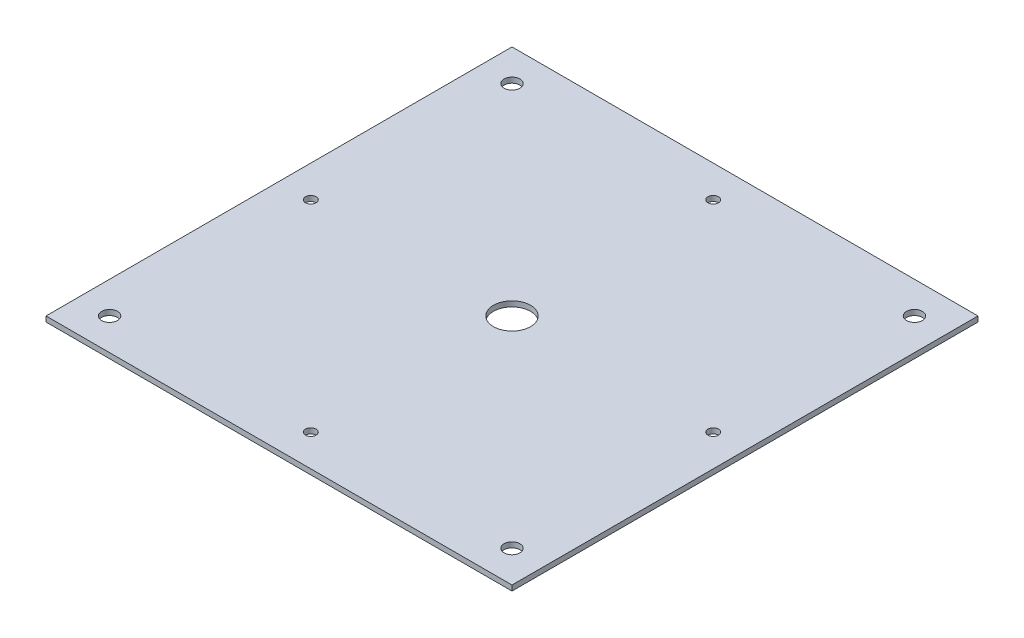
ISO-10303-21;
HEADER;
FILE_DESCRIPTION(('STEP AP214'),'2;1');
FILE_NAME('part.step','',(''),(''),'','','');
FILE_SCHEMA(('AUTOMOTIVE_DESIGN { 1 0 10303 214 1 1 1 1 }'));
ENDSEC;
DATA;
#1=APPLICATION_CONTEXT('core data for automotive mechanical design processes');
#2=APPLICATION_PROTOCOL_DEFINITION('international standard','automotive_design',2000,#1);
#3=PRODUCT_CONTEXT('',#1,'mechanical');
#4=PRODUCT('Part','Part','',(#3));
#5=PRODUCT_RELATED_PRODUCT_CATEGORY('part','',(#4));
#6=PRODUCT_DEFINITION_FORMATION('','',#4);
#7=PRODUCT_DEFINITION_CONTEXT('part definition',#1,'design');
#8=PRODUCT_DEFINITION('design','',#6,#7);
#9=PRODUCT_DEFINITION_SHAPE('','',#8);
#10=(LENGTH_UNIT() NAMED_UNIT(*) SI_UNIT(.MILLI.,.METRE.));
#11=(NAMED_UNIT(*) PLANE_ANGLE_UNIT() SI_UNIT($,.RADIAN.));
#12=(NAMED_UNIT(*) SI_UNIT($,.STERADIAN.) SOLID_ANGLE_UNIT());
#13=UNCERTAINTY_MEASURE_WITH_UNIT(LENGTH_MEASURE(1.E-05),#10,'distance_accuracy_value','');
#14=(GEOMETRIC_REPRESENTATION_CONTEXT(3) GLOBAL_UNCERTAINTY_ASSIGNED_CONTEXT((#13)) GLOBAL_UNIT_ASSIGNED_CONTEXT((#10,
#11,#12)) REPRESENTATION_CONTEXT('',''));
#15=CARTESIAN_POINT('',(0.,0.,0.));
#16=DIRECTION('',(0.,0.,1.));
#17=DIRECTION('',(1.,0.,0.));
#18=AXIS2_PLACEMENT_3D('',#15,#16,#17);
#19=CARTESIAN_POINT('',(0.,3.175,0.));
#20=DIRECTION('',(0.,1.,0.));
#21=DIRECTION('',(0.,0.,1.));
#22=AXIS2_PLACEMENT_3D('',#19,#20,#21);
#23=PLANE('',#22);
#24=CARTESIAN_POINT('',(120.649999999993,3.175,120.65));
#25=DIRECTION('',(0.,1.,0.));
#26=DIRECTION('',(0.,0.,1.));
#27=AXIS2_PLACEMENT_3D('',#24,#25,#26);
#28=CIRCLE('',#27,4.7625);
#29=CARTESIAN_POINT('',(120.649999999993,3.175,125.4125));
#30=VERTEX_POINT('',#29);
#31=EDGE_CURVE('E160',#30,#30,#28,.T.);
#32=ORIENTED_EDGE('',*,*,#31,.F.);
#33=EDGE_LOOP('',(#32));
#34=FACE_BOUND('',#33,.T.);
#35=CARTESIAN_POINT('',(-120.649999999993,3.175,120.65));
#36=DIRECTION('',(0.,1.,0.));
#37=DIRECTION('',(0.,0.,-1.));
#38=AXIS2_PLACEMENT_3D('',#35,#36,#37);
#39=CIRCLE('',#38,4.7625);
#40=CARTESIAN_POINT('',(-120.649999999993,3.175,115.8875));
#41=VERTEX_POINT('',#40);
#42=EDGE_CURVE('E154',#41,#41,#39,.T.);
#43=ORIENTED_EDGE('',*,*,#42,.F.);
#44=EDGE_LOOP('',(#43));
#45=FACE_BOUND('',#44,.T.);
#46=CARTESIAN_POINT('',(120.649999999993,3.175,-120.65));
#47=DIRECTION('',(0.,1.,0.));
#48=DIRECTION('',(0.,0.,-1.));
#49=AXIS2_PLACEMENT_3D('',#46,#47,#48);
#50=CIRCLE('',#49,4.7625);
#51=CARTESIAN_POINT('',(120.649999999993,3.175,-125.4125));
#52=VERTEX_POINT('',#51);
#53=EDGE_CURVE('E148',#52,#52,#50,.T.);
#54=ORIENTED_EDGE('',*,*,#53,.F.);
#55=EDGE_LOOP('',(#54));
#56=FACE_BOUND('',#55,.T.);
#57=CARTESIAN_POINT('',(-120.649999999993,3.175,-120.65));
#58=DIRECTION('',(0.,1.,0.));
#59=DIRECTION('',(0.,0.,1.));
#60=AXIS2_PLACEMENT_3D('',#57,#58,#59);
#61=CIRCLE('',#60,4.7625);
#62=CARTESIAN_POINT('',(-120.649999999993,3.175,-115.8875));
#63=VERTEX_POINT('',#62);
#64=EDGE_CURVE('E142',#63,#63,#61,.T.);
#65=ORIENTED_EDGE('',*,*,#64,.F.);
#66=EDGE_LOOP('',(#65));
#67=FACE_BOUND('',#66,.T.);
#68=CARTESIAN_POINT('',(-120.649999999993,3.175,6.85815848555649E-12));
#69=DIRECTION('',(0.,1.,0.));
#70=DIRECTION('',(0.,0.,1.));
#71=AXIS2_PLACEMENT_3D('',#68,#69,#70);
#72=CIRCLE('',#71,3.175);
#73=CARTESIAN_POINT('',(-120.649999999993,3.175,3.17500000000686));
#74=VERTEX_POINT('',#73);
#75=EDGE_CURVE('E136',#74,#74,#72,.T.);
#76=ORIENTED_EDGE('',*,*,#75,.F.);
#77=EDGE_LOOP('',(#76));
#78=FACE_BOUND('',#77,.T.);
#79=CARTESIAN_POINT('',(1.36867662438495E-11,3.175,120.65));
#80=DIRECTION('',(0.,1.,0.));
#81=DIRECTION('',(0.,0.,1.));
#82=AXIS2_PLACEMENT_3D('',#79,#80,#81);
#83=CIRCLE('',#82,3.175);
#84=CARTESIAN_POINT('',(1.36867662438495E-11,3.175,123.825));
#85=VERTEX_POINT('',#84);
#86=EDGE_CURVE('E130',#85,#85,#83,.T.);
#87=ORIENTED_EDGE('',*,*,#86,.F.);
#88=EDGE_LOOP('',(#87));
#89=FACE_BOUND('',#88,.T.);
#90=CARTESIAN_POINT('',(120.650000000007,3.175,-6.84338312192477E-12));
#91=DIRECTION('',(0.,1.,0.));
#92=DIRECTION('',(0.,0.,1.));
#93=AXIS2_PLACEMENT_3D('',#90,#91,#92);
#94=CIRCLE('',#93,3.175);
#95=CARTESIAN_POINT('',(120.650000000007,3.175,3.17499999999315));
#96=VERTEX_POINT('',#95);
#97=EDGE_CURVE('E124',#96,#96,#94,.T.);
#98=ORIENTED_EDGE('',*,*,#97,.F.);
#99=EDGE_LOOP('',(#98));
#100=FACE_BOUND('',#99,.T.);
#101=CARTESIAN_POINT('',(0.,3.175,-120.65));
#102=DIRECTION('',(0.,1.,0.));
#103=DIRECTION('',(0.,0.,1.));
#104=AXIS2_PLACEMENT_3D('',#101,#102,#103);
#105=CIRCLE('',#104,3.175);
#106=CARTESIAN_POINT('',(0.,3.175,-117.475));
#107=VERTEX_POINT('',#106);
#108=EDGE_CURVE('E118',#107,#107,#105,.T.);
#109=ORIENTED_EDGE('',*,*,#108,.F.);
#110=EDGE_LOOP('',(#109));
#111=FACE_BOUND('',#110,.T.);
#112=DIRECTION('',(0.,0.,1.));
#113=VECTOR('',#112,1.);
#114=CARTESIAN_POINT('',(-139.7,3.175,139.7));
#115=LINE('',#114,#113);
#116=CARTESIAN_POINT('',(-139.7,3.175,-139.7));
#117=VERTEX_POINT('',#116);
#118=CARTESIAN_POINT('',(-139.7,3.175,139.7));
#119=VERTEX_POINT('',#118);
#120=EDGE_CURVE('E85',#117,#119,#115,.T.);
#121=ORIENTED_EDGE('',*,*,#120,.T.);
#122=DIRECTION('',(1.,0.,0.));
#123=VECTOR('',#122,1.);
#124=CARTESIAN_POINT('',(139.7,3.175,139.7));
#125=LINE('',#124,#123);
#126=CARTESIAN_POINT('',(139.7,3.175,139.7));
#127=VERTEX_POINT('',#126);
#128=EDGE_CURVE('E80',#119,#127,#125,.T.);
#129=ORIENTED_EDGE('',*,*,#128,.T.);
#130=DIRECTION('',(0.,0.,-1.));
#131=VECTOR('',#130,1.);
#132=CARTESIAN_POINT('',(139.7,3.175,139.7));
#133=LINE('',#132,#131);
#134=CARTESIAN_POINT('',(139.7,3.175,-139.7));
#135=VERTEX_POINT('',#134);
#136=EDGE_CURVE('E83',#127,#135,#133,.T.);
#137=ORIENTED_EDGE('',*,*,#136,.T.);
#138=DIRECTION('',(-1.,0.,0.));
#139=VECTOR('',#138,1.);
#140=CARTESIAN_POINT('',(139.7,3.175,-139.7));
#141=LINE('',#140,#139);
#142=EDGE_CURVE('E50',#135,#117,#141,.T.);
#143=ORIENTED_EDGE('',*,*,#142,.T.);
#144=EDGE_LOOP('',(#121,#129,#137,#143));
#145=FACE_BOUND('',#144,.T.);
#146=CARTESIAN_POINT('',(0.,3.175,0.));
#147=DIRECTION('',(0.,1.,0.));
#148=DIRECTION('',(0.,0.,1.));
#149=AXIS2_PLACEMENT_3D('',#146,#147,#148);
#150=CIRCLE('',#149,11.1125);
#151=CARTESIAN_POINT('',(0.,3.175,11.1125));
#152=VERTEX_POINT('',#151);
#153=EDGE_CURVE('E100',#152,#152,#150,.T.);
#154=ORIENTED_EDGE('',*,*,#153,.F.);
#155=EDGE_LOOP('',(#154));
#156=FACE_BOUND('',#155,.T.);
#157=ADVANCED_FACE('F33',(#34,#45,#56,#67,#78,#89,#100,#111,#145,#156),#23,.T.);
#158=CARTESIAN_POINT('',(0.,0.,0.));
#159=DIRECTION('',(0.,1.,0.));
#160=DIRECTION('',(0.,0.,1.));
#161=AXIS2_PLACEMENT_3D('',#158,#159,#160);
#162=PLANE('',#161);
#163=CARTESIAN_POINT('',(120.649999999993,0.,120.65));
#164=DIRECTION('',(0.,1.,0.));
#165=DIRECTION('',(0.,0.,1.));
#166=AXIS2_PLACEMENT_3D('',#163,#164,#165);
#167=CIRCLE('',#166,4.7625);
#168=CARTESIAN_POINT('',(120.649999999993,0.,125.4125));
#169=VERTEX_POINT('',#168);
#170=EDGE_CURVE('E157',#169,#169,#167,.T.);
#171=ORIENTED_EDGE('',*,*,#170,.T.);
#172=EDGE_LOOP('',(#171));
#173=FACE_BOUND('',#172,.T.);
#174=CARTESIAN_POINT('',(-120.649999999993,0.,120.65));
#175=DIRECTION('',(0.,1.,0.));
#176=DIRECTION('',(0.,0.,-1.));
#177=AXIS2_PLACEMENT_3D('',#174,#175,#176);
#178=CIRCLE('',#177,4.7625);
#179=CARTESIAN_POINT('',(-120.649999999993,0.,115.8875));
#180=VERTEX_POINT('',#179);
#181=EDGE_CURVE('E151',#180,#180,#178,.T.);
#182=ORIENTED_EDGE('',*,*,#181,.T.);
#183=EDGE_LOOP('',(#182));
#184=FACE_BOUND('',#183,.T.);
#185=CARTESIAN_POINT('',(120.649999999993,0.,-120.65));
#186=DIRECTION('',(0.,1.,0.));
#187=DIRECTION('',(0.,0.,-1.));
#188=AXIS2_PLACEMENT_3D('',#185,#186,#187);
#189=CIRCLE('',#188,4.7625);
#190=CARTESIAN_POINT('',(120.649999999993,0.,-125.4125));
#191=VERTEX_POINT('',#190);
#192=EDGE_CURVE('E145',#191,#191,#189,.T.);
#193=ORIENTED_EDGE('',*,*,#192,.T.);
#194=EDGE_LOOP('',(#193));
#195=FACE_BOUND('',#194,.T.);
#196=CARTESIAN_POINT('',(-120.649999999993,0.,-120.65));
#197=DIRECTION('',(0.,1.,0.));
#198=DIRECTION('',(0.,0.,1.));
#199=AXIS2_PLACEMENT_3D('',#196,#197,#198);
#200=CIRCLE('',#199,4.7625);
#201=CARTESIAN_POINT('',(-120.649999999993,0.,-115.8875));
#202=VERTEX_POINT('',#201);
#203=EDGE_CURVE('E139',#202,#202,#200,.T.);
#204=ORIENTED_EDGE('',*,*,#203,.T.);
#205=EDGE_LOOP('',(#204));
#206=FACE_BOUND('',#205,.T.);
#207=CARTESIAN_POINT('',(-120.649999999993,0.,6.85815848555649E-12));
#208=DIRECTION('',(0.,1.,0.));
#209=DIRECTION('',(0.,0.,1.));
#210=AXIS2_PLACEMENT_3D('',#207,#208,#209);
#211=CIRCLE('',#210,3.175);
#212=CARTESIAN_POINT('',(-120.649999999993,0.,3.17500000000686));
#213=VERTEX_POINT('',#212);
#214=EDGE_CURVE('E133',#213,#213,#211,.T.);
#215=ORIENTED_EDGE('',*,*,#214,.T.);
#216=EDGE_LOOP('',(#215));
#217=FACE_BOUND('',#216,.T.);
#218=CARTESIAN_POINT('',(1.36867662438495E-11,0.,120.65));
#219=DIRECTION('',(0.,1.,0.));
#220=DIRECTION('',(0.,0.,1.));
#221=AXIS2_PLACEMENT_3D('',#218,#219,#220);
#222=CIRCLE('',#221,3.175);
#223=CARTESIAN_POINT('',(1.36867662438495E-11,0.,123.825));
#224=VERTEX_POINT('',#223);
#225=EDGE_CURVE('E127',#224,#224,#222,.T.);
#226=ORIENTED_EDGE('',*,*,#225,.T.);
#227=EDGE_LOOP('',(#226));
#228=FACE_BOUND('',#227,.T.);
#229=CARTESIAN_POINT('',(120.650000000007,0.,-6.84338312192477E-12));
#230=DIRECTION('',(0.,1.,0.));
#231=DIRECTION('',(0.,0.,1.));
#232=AXIS2_PLACEMENT_3D('',#229,#230,#231);
#233=CIRCLE('',#232,3.175);
#234=CARTESIAN_POINT('',(120.650000000007,0.,3.17499999999315));
#235=VERTEX_POINT('',#234);
#236=EDGE_CURVE('E121',#235,#235,#233,.T.);
#237=ORIENTED_EDGE('',*,*,#236,.T.);
#238=EDGE_LOOP('',(#237));
#239=FACE_BOUND('',#238,.T.);
#240=CARTESIAN_POINT('',(0.,0.,-120.65));
#241=DIRECTION('',(0.,1.,0.));
#242=DIRECTION('',(0.,0.,1.));
#243=AXIS2_PLACEMENT_3D('',#240,#241,#242);
#244=CIRCLE('',#243,3.175);
#245=CARTESIAN_POINT('',(0.,0.,-117.475));
#246=VERTEX_POINT('',#245);
#247=EDGE_CURVE('E115',#246,#246,#244,.T.);
#248=ORIENTED_EDGE('',*,*,#247,.T.);
#249=EDGE_LOOP('',(#248));
#250=FACE_BOUND('',#249,.T.);
#251=DIRECTION('',(0.,0.,1.));
#252=VECTOR('',#251,1.);
#253=CARTESIAN_POINT('',(-139.7,0.,139.7));
#254=LINE('',#253,#252);
#255=CARTESIAN_POINT('',(-139.7,0.,-139.7));
#256=VERTEX_POINT('',#255);
#257=CARTESIAN_POINT('',(-139.7,0.,139.7));
#258=VERTEX_POINT('',#257);
#259=EDGE_CURVE('E97',#256,#258,#254,.T.);
#260=ORIENTED_EDGE('',*,*,#259,.F.);
#261=DIRECTION('',(-1.,0.,0.));
#262=VECTOR('',#261,1.);
#263=CARTESIAN_POINT('',(139.7,0.,-139.7));
#264=LINE('',#263,#262);
#265=CARTESIAN_POINT('',(139.7,0.,-139.7));
#266=VERTEX_POINT('',#265);
#267=EDGE_CURVE('E73',#266,#256,#264,.T.);
#268=ORIENTED_EDGE('',*,*,#267,.F.);
#269=DIRECTION('',(0.,0.,-1.));
#270=VECTOR('',#269,1.);
#271=CARTESIAN_POINT('',(139.7,0.,139.7));
#272=LINE('',#271,#270);
#273=CARTESIAN_POINT('',(139.7,0.,139.7));
#274=VERTEX_POINT('',#273);
#275=EDGE_CURVE('E67',#274,#266,#272,.T.);
#276=ORIENTED_EDGE('',*,*,#275,.F.);
#277=DIRECTION('',(1.,0.,0.));
#278=VECTOR('',#277,1.);
#279=CARTESIAN_POINT('',(139.7,0.,139.7));
#280=LINE('',#279,#278);
#281=EDGE_CURVE('E89',#258,#274,#280,.T.);
#282=ORIENTED_EDGE('',*,*,#281,.F.);
#283=EDGE_LOOP('',(#260,#268,#276,#282));
#284=FACE_BOUND('',#283,.T.);
#285=CARTESIAN_POINT('',(0.,0.,0.));
#286=DIRECTION('',(0.,1.,0.));
#287=DIRECTION('',(0.,0.,1.));
#288=AXIS2_PLACEMENT_3D('',#285,#286,#287);
#289=CIRCLE('',#288,11.1125);
#290=CARTESIAN_POINT('',(0.,0.,11.1125));
#291=VERTEX_POINT('',#290);
#292=EDGE_CURVE('E112',#291,#291,#289,.T.);
#293=ORIENTED_EDGE('',*,*,#292,.T.);
#294=EDGE_LOOP('',(#293));
#295=FACE_BOUND('',#294,.T.);
#296=ADVANCED_FACE('F108',(#173,#184,#195,#206,#217,#228,#239,#250,#284,#295),#162,.F.);
#297=CARTESIAN_POINT('',(-139.7,3.175,139.7));
#298=DIRECTION('',(1.,0.,0.));
#299=DIRECTION('',(0.,0.,-1.));
#300=AXIS2_PLACEMENT_3D('',#297,#298,#299);
#301=PLANE('',#300);
#302=ORIENTED_EDGE('',*,*,#259,.T.);
#303=DIRECTION('',(0.,-1.,0.));
#304=VECTOR('',#303,1.);
#305=CARTESIAN_POINT('',(-139.7,3.175,139.7));
#306=LINE('',#305,#304);
#307=EDGE_CURVE('E11',#119,#258,#306,.T.);
#308=ORIENTED_EDGE('',*,*,#307,.F.);
#309=ORIENTED_EDGE('',*,*,#120,.F.);
#310=DIRECTION('',(0.,-1.,0.));
#311=VECTOR('',#310,1.);
#312=CARTESIAN_POINT('',(-139.7,3.175,-139.7));
#313=LINE('',#312,#311);
#314=EDGE_CURVE('E93',#117,#256,#313,.T.);
#315=ORIENTED_EDGE('',*,*,#314,.T.);
#316=EDGE_LOOP('',(#302,#308,#309,#315));
#317=FACE_BOUND('',#316,.T.);
#318=ADVANCED_FACE('F35',(#317),#301,.F.);
#319=CARTESIAN_POINT('',(139.7,3.175,139.7));
#320=DIRECTION('',(0.,0.,-1.));
#321=DIRECTION('',(-1.,0.,0.));
#322=AXIS2_PLACEMENT_3D('',#319,#320,#321);
#323=PLANE('',#322);
#324=ORIENTED_EDGE('',*,*,#281,.T.);
#325=DIRECTION('',(0.,-1.,0.));
#326=VECTOR('',#325,1.);
#327=CARTESIAN_POINT('',(139.7,3.175,139.7));
#328=LINE('',#327,#326);
#329=EDGE_CURVE('E42',#127,#274,#328,.T.);
#330=ORIENTED_EDGE('',*,*,#329,.F.);
#331=ORIENTED_EDGE('',*,*,#128,.F.);
#332=ORIENTED_EDGE('',*,*,#307,.T.);
#333=EDGE_LOOP('',(#324,#330,#331,#332));
#334=FACE_BOUND('',#333,.T.);
#335=ADVANCED_FACE('F88',(#334),#323,.F.);
#336=CARTESIAN_POINT('',(139.7,3.175,139.7));
#337=DIRECTION('',(-1.,0.,0.));
#338=DIRECTION('',(0.,0.,1.));
#339=AXIS2_PLACEMENT_3D('',#336,#337,#338);
#340=PLANE('',#339);
#341=ORIENTED_EDGE('',*,*,#275,.T.);
#342=DIRECTION('',(0.,-1.,0.));
#343=VECTOR('',#342,1.);
#344=CARTESIAN_POINT('',(139.7,3.175,-139.7));
#345=LINE('',#344,#343);
#346=EDGE_CURVE('E90',#135,#266,#345,.T.);
#347=ORIENTED_EDGE('',*,*,#346,.F.);
#348=ORIENTED_EDGE('',*,*,#136,.F.);
#349=ORIENTED_EDGE('',*,*,#329,.T.);
#350=EDGE_LOOP('',(#341,#347,#348,#349));
#351=FACE_BOUND('',#350,.T.);
#352=ADVANCED_FACE('F91',(#351),#340,.F.);
#353=CARTESIAN_POINT('',(139.7,3.175,-139.7));
#354=DIRECTION('',(0.,0.,1.));
#355=DIRECTION('',(1.,0.,0.));
#356=AXIS2_PLACEMENT_3D('',#353,#354,#355);
#357=PLANE('',#356);
#358=ORIENTED_EDGE('',*,*,#267,.T.);
#359=ORIENTED_EDGE('',*,*,#314,.F.);
#360=ORIENTED_EDGE('',*,*,#142,.F.);
#361=ORIENTED_EDGE('',*,*,#346,.T.);
#362=EDGE_LOOP('',(#358,#359,#360,#361));
#363=FACE_BOUND('',#362,.T.);
#364=ADVANCED_FACE('F105',(#363),#357,.F.);
#365=CARTESIAN_POINT('',(0.,3.175,0.));
#366=DIRECTION('',(0.,-1.,0.));
#367=DIRECTION('',(0.,0.,-1.));
#368=AXIS2_PLACEMENT_3D('',#365,#366,#367);
#369=CYLINDRICAL_SURFACE('',#368,11.1125);
#370=ORIENTED_EDGE('',*,*,#153,.T.);
#371=EDGE_LOOP('',(#370));
#372=FACE_BOUND('',#371,.T.);
#373=ORIENTED_EDGE('',*,*,#292,.F.);
#374=EDGE_LOOP('',(#373));
#375=FACE_BOUND('',#374,.T.);
#376=ADVANCED_FACE('F195',(#372,#375),#369,.F.);
#377=CARTESIAN_POINT('',(0.,0.,-120.65));
#378=DIRECTION('',(0.,1.,0.));
#379=DIRECTION('',(0.,0.,1.));
#380=AXIS2_PLACEMENT_3D('',#377,#378,#379);
#381=CYLINDRICAL_SURFACE('',#380,3.175);
#382=ORIENTED_EDGE('',*,*,#247,.F.);
#383=EDGE_LOOP('',(#382));
#384=FACE_BOUND('',#383,.T.);
#385=ORIENTED_EDGE('',*,*,#108,.T.);
#386=EDGE_LOOP('',(#385));
#387=FACE_BOUND('',#386,.T.);
#388=ADVANCED_FACE('F192',(#384,#387),#381,.F.);
#389=CARTESIAN_POINT('',(120.650000000007,0.,-6.84338312192477E-12));
#390=DIRECTION('',(0.,1.,0.));
#391=DIRECTION('',(0.,0.,1.));
#392=AXIS2_PLACEMENT_3D('',#389,#390,#391);
#393=CYLINDRICAL_SURFACE('',#392,3.175);
#394=ORIENTED_EDGE('',*,*,#236,.F.);
#395=EDGE_LOOP('',(#394));
#396=FACE_BOUND('',#395,.T.);
#397=ORIENTED_EDGE('',*,*,#97,.T.);
#398=EDGE_LOOP('',(#397));
#399=FACE_BOUND('',#398,.T.);
#400=ADVANCED_FACE('F194',(#396,#399),#393,.F.);
#401=CARTESIAN_POINT('',(1.36867662438495E-11,0.,120.65));
#402=DIRECTION('',(0.,1.,0.));
#403=DIRECTION('',(0.,0.,1.));
#404=AXIS2_PLACEMENT_3D('',#401,#402,#403);
#405=CYLINDRICAL_SURFACE('',#404,3.175);
#406=ORIENTED_EDGE('',*,*,#225,.F.);
#407=EDGE_LOOP('',(#406));
#408=FACE_BOUND('',#407,.T.);
#409=ORIENTED_EDGE('',*,*,#86,.T.);
#410=EDGE_LOOP('',(#409));
#411=FACE_BOUND('',#410,.T.);
#412=ADVANCED_FACE('F202',(#408,#411),#405,.F.);
#413=CARTESIAN_POINT('',(-120.649999999993,0.,6.85815848555649E-12));
#414=DIRECTION('',(0.,1.,0.));
#415=DIRECTION('',(0.,0.,1.));
#416=AXIS2_PLACEMENT_3D('',#413,#414,#415);
#417=CYLINDRICAL_SURFACE('',#416,3.175);
#418=ORIENTED_EDGE('',*,*,#214,.F.);
#419=EDGE_LOOP('',(#418));
#420=FACE_BOUND('',#419,.T.);
#421=ORIENTED_EDGE('',*,*,#75,.T.);
#422=EDGE_LOOP('',(#421));
#423=FACE_BOUND('',#422,.T.);
#424=ADVANCED_FACE('F274',(#420,#423),#417,.F.);
#425=CARTESIAN_POINT('',(-120.649999999993,0.,-120.65));
#426=DIRECTION('',(0.,1.,0.));
#427=DIRECTION('',(0.,0.,1.));
#428=AXIS2_PLACEMENT_3D('',#425,#426,#427);
#429=CYLINDRICAL_SURFACE('',#428,4.7625);
#430=ORIENTED_EDGE('',*,*,#203,.F.);
#431=EDGE_LOOP('',(#430));
#432=FACE_BOUND('',#431,.T.);
#433=ORIENTED_EDGE('',*,*,#64,.T.);
#434=EDGE_LOOP('',(#433));
#435=FACE_BOUND('',#434,.T.);
#436=ADVANCED_FACE('F282',(#432,#435),#429,.F.);
#437=CARTESIAN_POINT('',(120.649999999993,0.,-120.65));
#438=DIRECTION('',(0.,1.,0.));
#439=DIRECTION('',(0.,0.,1.));
#440=AXIS2_PLACEMENT_3D('',#437,#438,#439);
#441=CYLINDRICAL_SURFACE('',#440,4.7625);
#442=ORIENTED_EDGE('',*,*,#192,.F.);
#443=EDGE_LOOP('',(#442));
#444=FACE_BOUND('',#443,.T.);
#445=ORIENTED_EDGE('',*,*,#53,.T.);
#446=EDGE_LOOP('',(#445));
#447=FACE_BOUND('',#446,.T.);
#448=ADVANCED_FACE('F291',(#444,#447),#441,.F.);
#449=CARTESIAN_POINT('',(-120.649999999993,0.,120.65));
#450=DIRECTION('',(0.,1.,0.));
#451=DIRECTION('',(0.,0.,1.));
#452=AXIS2_PLACEMENT_3D('',#449,#450,#451);
#453=CYLINDRICAL_SURFACE('',#452,4.7625);
#454=ORIENTED_EDGE('',*,*,#181,.F.);
#455=EDGE_LOOP('',(#454));
#456=FACE_BOUND('',#455,.T.);
#457=ORIENTED_EDGE('',*,*,#42,.T.);
#458=EDGE_LOOP('',(#457));
#459=FACE_BOUND('',#458,.T.);
#460=ADVANCED_FACE('F171',(#456,#459),#453,.F.);
#461=CARTESIAN_POINT('',(120.649999999993,0.,120.65));
#462=DIRECTION('',(0.,1.,0.));
#463=DIRECTION('',(0.,0.,1.));
#464=AXIS2_PLACEMENT_3D('',#461,#462,#463);
#465=CYLINDRICAL_SURFACE('',#464,4.7625);
#466=ORIENTED_EDGE('',*,*,#170,.F.);
#467=EDGE_LOOP('',(#466));
#468=FACE_BOUND('',#467,.T.);
#469=ORIENTED_EDGE('',*,*,#31,.T.);
#470=EDGE_LOOP('',(#469));
#471=FACE_BOUND('',#470,.T.);
#472=ADVANCED_FACE('F168',(#468,#471),#465,.F.);
#473=CLOSED_SHELL('',(#157,#296,#318,#335,#352,#364,#376,#388,#400,#412,#424,#436,#448,#460,#472));
#474=MANIFOLD_SOLID_BREP('B2',#473);
#475=ADVANCED_BREP_SHAPE_REPRESENTATION('',(#18,#474),#14);
#476=SHAPE_DEFINITION_REPRESENTATION(#9,#475);
ENDSEC;
END-ISO-10303-21;
